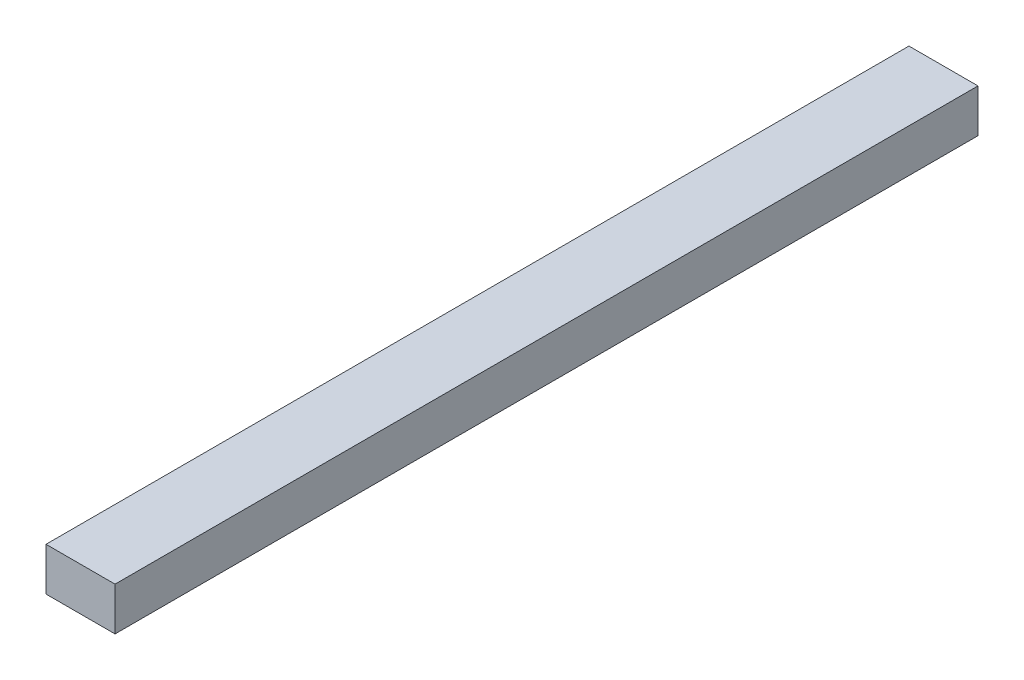
ISO-10303-21;
HEADER;
FILE_DESCRIPTION(('STEP AP214'),'2;1');
FILE_NAME('part.step','',(''),(''),'','','');
FILE_SCHEMA(('AUTOMOTIVE_DESIGN { 1 0 10303 214 1 1 1 1 }'));
ENDSEC;
DATA;
#1=APPLICATION_CONTEXT('core data for automotive mechanical design processes');
#2=APPLICATION_PROTOCOL_DEFINITION('international standard','automotive_design',2000,#1);
#3=PRODUCT_CONTEXT('',#1,'mechanical');
#4=PRODUCT('Part','Part','',(#3));
#5=PRODUCT_RELATED_PRODUCT_CATEGORY('part','',(#4));
#6=PRODUCT_DEFINITION_FORMATION('','',#4);
#7=PRODUCT_DEFINITION_CONTEXT('part definition',#1,'design');
#8=PRODUCT_DEFINITION('design','',#6,#7);
#9=PRODUCT_DEFINITION_SHAPE('','',#8);
#10=(LENGTH_UNIT() NAMED_UNIT(*) SI_UNIT(.MILLI.,.METRE.));
#11=(NAMED_UNIT(*) PLANE_ANGLE_UNIT() SI_UNIT($,.RADIAN.));
#12=(NAMED_UNIT(*) SI_UNIT($,.STERADIAN.) SOLID_ANGLE_UNIT());
#13=UNCERTAINTY_MEASURE_WITH_UNIT(LENGTH_MEASURE(1.E-05),#10,'distance_accuracy_value','');
#14=(GEOMETRIC_REPRESENTATION_CONTEXT(3) GLOBAL_UNCERTAINTY_ASSIGNED_CONTEXT((#13)) GLOBAL_UNIT_ASSIGNED_CONTEXT((#10,
#11,#12)) REPRESENTATION_CONTEXT('',''));
#15=CARTESIAN_POINT('',(0.,0.,0.));
#16=DIRECTION('',(0.,0.,1.));
#17=DIRECTION('',(1.,0.,0.));
#18=AXIS2_PLACEMENT_3D('',#15,#16,#17);
#19=CARTESIAN_POINT('',(0.,0.,500.));
#20=DIRECTION('',(1.,0.,0.));
#21=DIRECTION('',(0.,0.,-1.));
#22=AXIS2_PLACEMENT_3D('',#19,#20,#21);
#23=PLANE('',#22);
#24=DIRECTION('',(0.,-1.,0.));
#25=VECTOR('',#24,1.);
#26=CARTESIAN_POINT('',(0.,0.,0.));
#27=LINE('',#26,#25);
#28=CARTESIAN_POINT('',(0.,25.,0.));
#29=VERTEX_POINT('',#28);
#30=CARTESIAN_POINT('',(0.,0.,0.));
#31=VERTEX_POINT('',#30);
#32=EDGE_CURVE('E96',#29,#31,#27,.T.);
#33=ORIENTED_EDGE('',*,*,#32,.T.);
#34=DIRECTION('',(0.,0.,-1.));
#35=VECTOR('',#34,1.);
#36=CARTESIAN_POINT('',(0.,0.,500.));
#37=LINE('',#36,#35);
#38=CARTESIAN_POINT('',(0.,0.,500.));
#39=VERTEX_POINT('',#38);
#40=EDGE_CURVE('E11',#39,#31,#37,.T.);
#41=ORIENTED_EDGE('',*,*,#40,.F.);
#42=DIRECTION('',(0.,-1.,0.));
#43=VECTOR('',#42,1.);
#44=CARTESIAN_POINT('',(0.,0.,500.));
#45=LINE('',#44,#43);
#46=CARTESIAN_POINT('',(0.,25.,500.));
#47=VERTEX_POINT('',#46);
#48=EDGE_CURVE('E84',#47,#39,#45,.T.);
#49=ORIENTED_EDGE('',*,*,#48,.F.);
#50=DIRECTION('',(0.,0.,-1.));
#51=VECTOR('',#50,1.);
#52=CARTESIAN_POINT('',(0.,25.,500.));
#53=LINE('',#52,#51);
#54=EDGE_CURVE('E92',#47,#29,#53,.T.);
#55=ORIENTED_EDGE('',*,*,#54,.T.);
#56=EDGE_LOOP('',(#33,#41,#49,#55));
#57=FACE_BOUND('',#56,.T.);
#58=ADVANCED_FACE('F33',(#57),#23,.F.);
#59=CARTESIAN_POINT('',(0.,0.,500.));
#60=DIRECTION('',(0.,1.,0.));
#61=DIRECTION('',(0.,0.,1.));
#62=AXIS2_PLACEMENT_3D('',#59,#60,#61);
#63=PLANE('',#62);
#64=DIRECTION('',(1.,0.,0.));
#65=VECTOR('',#64,1.);
#66=CARTESIAN_POINT('',(0.,0.,0.));
#67=LINE('',#66,#65);
#68=CARTESIAN_POINT('',(40.,0.,0.));
#69=VERTEX_POINT('',#68);
#70=EDGE_CURVE('E88',#31,#69,#67,.T.);
#71=ORIENTED_EDGE('',*,*,#70,.T.);
#72=DIRECTION('',(0.,0.,-1.));
#73=VECTOR('',#72,1.);
#74=CARTESIAN_POINT('',(40.,0.,500.));
#75=LINE('',#74,#73);
#76=CARTESIAN_POINT('',(40.,0.,500.));
#77=VERTEX_POINT('',#76);
#78=EDGE_CURVE('E41',#77,#69,#75,.T.);
#79=ORIENTED_EDGE('',*,*,#78,.F.);
#80=DIRECTION('',(1.,0.,0.));
#81=VECTOR('',#80,1.);
#82=CARTESIAN_POINT('',(0.,0.,500.));
#83=LINE('',#82,#81);
#84=EDGE_CURVE('E79',#39,#77,#83,.T.);
#85=ORIENTED_EDGE('',*,*,#84,.F.);
#86=ORIENTED_EDGE('',*,*,#40,.T.);
#87=EDGE_LOOP('',(#71,#79,#85,#86));
#88=FACE_BOUND('',#87,.T.);
#89=ADVANCED_FACE('F87',(#88),#63,.F.);
#90=CARTESIAN_POINT('',(40.,0.,500.));
#91=DIRECTION('',(-1.,0.,0.));
#92=DIRECTION('',(0.,0.,1.));
#93=AXIS2_PLACEMENT_3D('',#90,#91,#92);
#94=PLANE('',#93);
#95=DIRECTION('',(0.,1.,0.));
#96=VECTOR('',#95,1.);
#97=CARTESIAN_POINT('',(40.,0.,0.));
#98=LINE('',#97,#96);
#99=CARTESIAN_POINT('',(40.,25.,0.));
#100=VERTEX_POINT('',#99);
#101=EDGE_CURVE('E66',#69,#100,#98,.T.);
#102=ORIENTED_EDGE('',*,*,#101,.T.);
#103=DIRECTION('',(0.,0.,-1.));
#104=VECTOR('',#103,1.);
#105=CARTESIAN_POINT('',(40.,25.,500.));
#106=LINE('',#105,#104);
#107=CARTESIAN_POINT('',(40.,25.,500.));
#108=VERTEX_POINT('',#107);
#109=EDGE_CURVE('E89',#108,#100,#106,.T.);
#110=ORIENTED_EDGE('',*,*,#109,.F.);
#111=DIRECTION('',(0.,1.,0.));
#112=VECTOR('',#111,1.);
#113=CARTESIAN_POINT('',(40.,0.,500.));
#114=LINE('',#113,#112);
#115=EDGE_CURVE('E82',#77,#108,#114,.T.);
#116=ORIENTED_EDGE('',*,*,#115,.F.);
#117=ORIENTED_EDGE('',*,*,#78,.T.);
#118=EDGE_LOOP('',(#102,#110,#116,#117));
#119=FACE_BOUND('',#118,.T.);
#120=ADVANCED_FACE('F90',(#119),#94,.F.);
#121=CARTESIAN_POINT('',(0.,25.,500.));
#122=DIRECTION('',(0.,-1.,0.));
#123=DIRECTION('',(0.,0.,-1.));
#124=AXIS2_PLACEMENT_3D('',#121,#122,#123);
#125=PLANE('',#124);
#126=DIRECTION('',(-1.,0.,0.));
#127=VECTOR('',#126,1.);
#128=CARTESIAN_POINT('',(0.,25.,0.));
#129=LINE('',#128,#127);
#130=EDGE_CURVE('E72',#100,#29,#129,.T.);
#131=ORIENTED_EDGE('',*,*,#130,.T.);
#132=ORIENTED_EDGE('',*,*,#54,.F.);
#133=DIRECTION('',(-1.,0.,0.));
#134=VECTOR('',#133,1.);
#135=CARTESIAN_POINT('',(0.,25.,500.));
#136=LINE('',#135,#134);
#137=EDGE_CURVE('E49',#108,#47,#136,.T.);
#138=ORIENTED_EDGE('',*,*,#137,.F.);
#139=ORIENTED_EDGE('',*,*,#109,.T.);
#140=EDGE_LOOP('',(#131,#132,#138,#139));
#141=FACE_BOUND('',#140,.T.);
#142=ADVANCED_FACE('F103',(#141),#125,.F.);
#143=CARTESIAN_POINT('',(0.,0.,500.));
#144=DIRECTION('',(0.,0.,-1.));
#145=DIRECTION('',(-1.,0.,0.));
#146=AXIS2_PLACEMENT_3D('',#143,#144,#145);
#147=PLANE('',#146);
#148=ORIENTED_EDGE('',*,*,#48,.T.);
#149=ORIENTED_EDGE('',*,*,#84,.T.);
#150=ORIENTED_EDGE('',*,*,#115,.T.);
#151=ORIENTED_EDGE('',*,*,#137,.T.);
#152=EDGE_LOOP('',(#148,#149,#150,#151));
#153=FACE_BOUND('',#152,.T.);
#154=ADVANCED_FACE('F80',(#153),#147,.F.);
#155=CARTESIAN_POINT('',(0.,0.,0.));
#156=DIRECTION('',(0.,0.,-1.));
#157=DIRECTION('',(-1.,0.,0.));
#158=AXIS2_PLACEMENT_3D('',#155,#156,#157);
#159=PLANE('',#158);
#160=ORIENTED_EDGE('',*,*,#32,.F.);
#161=ORIENTED_EDGE('',*,*,#130,.F.);
#162=ORIENTED_EDGE('',*,*,#101,.F.);
#163=ORIENTED_EDGE('',*,*,#70,.F.);
#164=EDGE_LOOP('',(#160,#161,#162,#163));
#165=FACE_BOUND('',#164,.T.);
#166=ADVANCED_FACE('F106',(#165),#159,.T.);
#167=CLOSED_SHELL('',(#58,#89,#120,#142,#154,#166));
#168=MANIFOLD_SOLID_BREP('B2',#167);
#169=ADVANCED_BREP_SHAPE_REPRESENTATION('',(#18,#168),#14);
#170=SHAPE_DEFINITION_REPRESENTATION(#9,#169);
ENDSEC;
END-ISO-10303-21;
